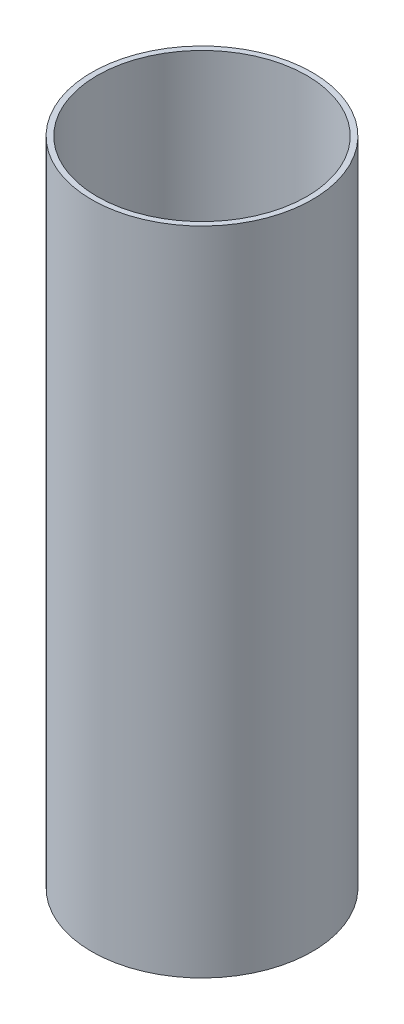
ISO-10303-21;
HEADER;
FILE_DESCRIPTION(('STEP AP214'),'2;1');
FILE_NAME('part.step','',(''),(''),'','','');
FILE_SCHEMA(('AUTOMOTIVE_DESIGN { 1 0 10303 214 1 1 1 1 }'));
ENDSEC;
DATA;
#1=APPLICATION_CONTEXT('core data for automotive mechanical design processes');
#2=APPLICATION_PROTOCOL_DEFINITION('international standard','automotive_design',2000,#1);
#3=PRODUCT_CONTEXT('',#1,'mechanical');
#4=PRODUCT('Part','Part','',(#3));
#5=PRODUCT_RELATED_PRODUCT_CATEGORY('part','',(#4));
#6=PRODUCT_DEFINITION_FORMATION('','',#4);
#7=PRODUCT_DEFINITION_CONTEXT('part definition',#1,'design');
#8=PRODUCT_DEFINITION('design','',#6,#7);
#9=PRODUCT_DEFINITION_SHAPE('','',#8);
#10=(LENGTH_UNIT() NAMED_UNIT(*) SI_UNIT(.MILLI.,.METRE.));
#11=(NAMED_UNIT(*) PLANE_ANGLE_UNIT() SI_UNIT($,.RADIAN.));
#12=(NAMED_UNIT(*) SI_UNIT($,.STERADIAN.) SOLID_ANGLE_UNIT());
#13=UNCERTAINTY_MEASURE_WITH_UNIT(LENGTH_MEASURE(1.E-05),#10,'distance_accuracy_value','');
#14=(GEOMETRIC_REPRESENTATION_CONTEXT(3) GLOBAL_UNCERTAINTY_ASSIGNED_CONTEXT((#13)) GLOBAL_UNIT_ASSIGNED_CONTEXT((#10,
#11,#12)) REPRESENTATION_CONTEXT('',''));
#15=CARTESIAN_POINT('',(0.,0.,0.));
#16=DIRECTION('',(0.,0.,1.));
#17=DIRECTION('',(1.,0.,0.));
#18=AXIS2_PLACEMENT_3D('',#15,#16,#17);
#19=CARTESIAN_POINT('',(0.,150.,0.));
#20=DIRECTION('',(0.,1.,0.));
#21=DIRECTION('',(0.,0.,1.));
#22=AXIS2_PLACEMENT_3D('',#19,#20,#21);
#23=PLANE('',#22);
#24=CARTESIAN_POINT('',(0.,150.,0.));
#25=DIRECTION('',(0.,1.,0.));
#26=DIRECTION('',(0.,0.,1.));
#27=AXIS2_PLACEMENT_3D('',#24,#25,#26);
#28=CIRCLE('',#27,25.4);
#29=CARTESIAN_POINT('',(0.,150.,25.4));
#30=VERTEX_POINT('',#29);
#31=EDGE_CURVE('E10',#30,#30,#28,.T.);
#32=ORIENTED_EDGE('',*,*,#31,.T.);
#33=EDGE_LOOP('',(#32));
#34=FACE_BOUND('',#33,.T.);
#35=CARTESIAN_POINT('',(0.,150.,0.));
#36=DIRECTION('',(0.,1.,0.));
#37=DIRECTION('',(0.,0.,1.));
#38=AXIS2_PLACEMENT_3D('',#35,#36,#37);
#39=CIRCLE('',#38,24.15);
#40=CARTESIAN_POINT('',(0.,150.,24.15));
#41=VERTEX_POINT('',#40);
#42=EDGE_CURVE('E45',#41,#41,#39,.T.);
#43=ORIENTED_EDGE('',*,*,#42,.F.);
#44=EDGE_LOOP('',(#43));
#45=FACE_BOUND('',#44,.T.);
#46=ADVANCED_FACE('F34',(#34,#45),#23,.T.);
#47=CARTESIAN_POINT('',(0.,0.,0.));
#48=DIRECTION('',(0.,1.,0.));
#49=DIRECTION('',(0.,0.,1.));
#50=AXIS2_PLACEMENT_3D('',#47,#48,#49);
#51=PLANE('',#50);
#52=CARTESIAN_POINT('',(0.,0.,0.));
#53=DIRECTION('',(0.,1.,0.));
#54=DIRECTION('',(0.,0.,1.));
#55=AXIS2_PLACEMENT_3D('',#52,#53,#54);
#56=CIRCLE('',#55,25.4);
#57=CARTESIAN_POINT('',(0.,0.,25.4));
#58=VERTEX_POINT('',#57);
#59=EDGE_CURVE('E38',#58,#58,#56,.T.);
#60=ORIENTED_EDGE('',*,*,#59,.F.);
#61=EDGE_LOOP('',(#60));
#62=FACE_BOUND('',#61,.T.);
#63=CARTESIAN_POINT('',(0.,0.,0.));
#64=DIRECTION('',(0.,1.,0.));
#65=DIRECTION('',(0.,0.,1.));
#66=AXIS2_PLACEMENT_3D('',#63,#64,#65);
#67=CIRCLE('',#66,24.15);
#68=CARTESIAN_POINT('',(0.,0.,24.15));
#69=VERTEX_POINT('',#68);
#70=EDGE_CURVE('E47',#69,#69,#67,.T.);
#71=ORIENTED_EDGE('',*,*,#70,.T.);
#72=EDGE_LOOP('',(#71));
#73=FACE_BOUND('',#72,.T.);
#74=ADVANCED_FACE('F57',(#62,#73),#51,.F.);
#75=CARTESIAN_POINT('',(0.,150.,0.));
#76=DIRECTION('',(0.,-1.,0.));
#77=DIRECTION('',(0.,0.,-1.));
#78=AXIS2_PLACEMENT_3D('',#75,#76,#77);
#79=CYLINDRICAL_SURFACE('',#78,25.4);
#80=ORIENTED_EDGE('',*,*,#31,.F.);
#81=EDGE_LOOP('',(#80));
#82=FACE_BOUND('',#81,.T.);
#83=ORIENTED_EDGE('',*,*,#59,.T.);
#84=EDGE_LOOP('',(#83));
#85=FACE_BOUND('',#84,.T.);
#86=ADVANCED_FACE('F36',(#82,#85),#79,.T.);
#87=CARTESIAN_POINT('',(0.,150.,0.));
#88=DIRECTION('',(0.,-1.,0.));
#89=DIRECTION('',(0.,0.,-1.));
#90=AXIS2_PLACEMENT_3D('',#87,#88,#89);
#91=CYLINDRICAL_SURFACE('',#90,24.15);
#92=ORIENTED_EDGE('',*,*,#42,.T.);
#93=EDGE_LOOP('',(#92));
#94=FACE_BOUND('',#93,.T.);
#95=ORIENTED_EDGE('',*,*,#70,.F.);
#96=EDGE_LOOP('',(#95));
#97=FACE_BOUND('',#96,.T.);
#98=ADVANCED_FACE('F53',(#94,#97),#91,.F.);
#99=CLOSED_SHELL('',(#46,#74,#86,#98));
#100=MANIFOLD_SOLID_BREP('B2',#99);
#101=ADVANCED_BREP_SHAPE_REPRESENTATION('',(#18,#100),#14);
#102=SHAPE_DEFINITION_REPRESENTATION(#9,#101);
ENDSEC;
END-ISO-10303-21;
